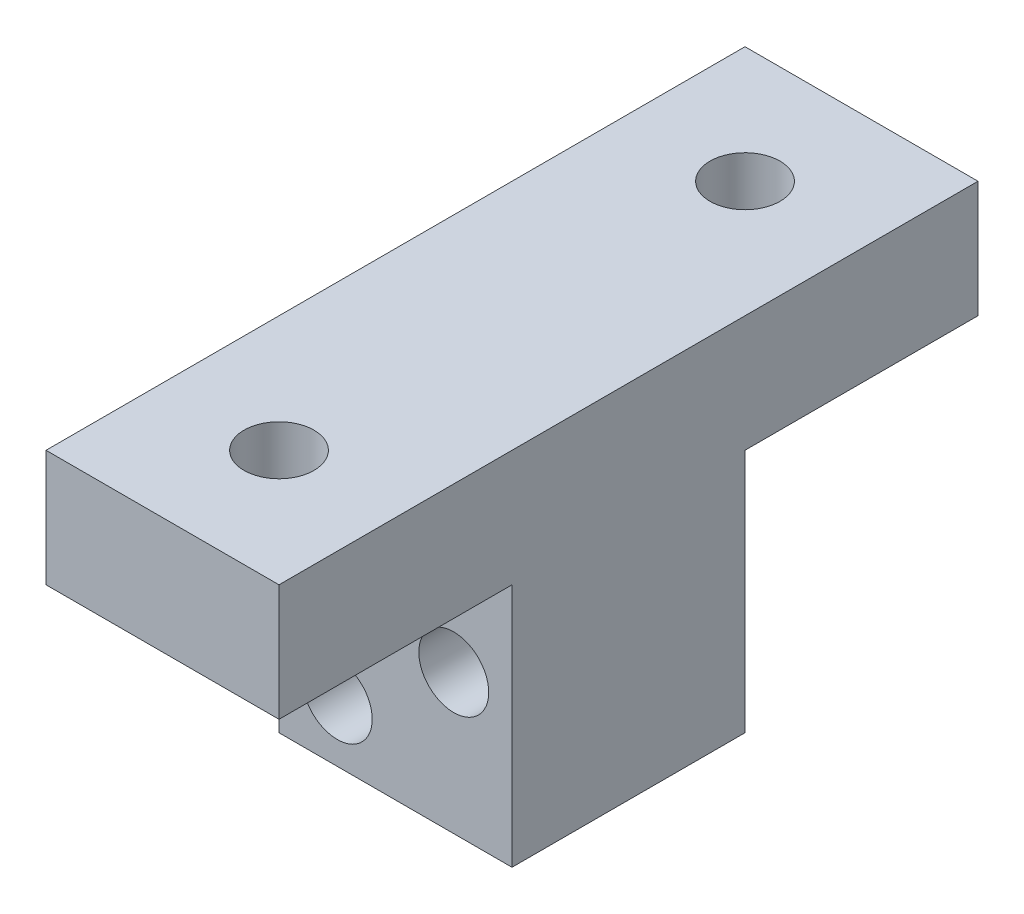
ISO-10303-21;
HEADER;
FILE_DESCRIPTION(('STEP AP214'),'2;1');
FILE_NAME('part.step','',(''),(''),'','','');
FILE_SCHEMA(('AUTOMOTIVE_DESIGN { 1 0 10303 214 1 1 1 1 }'));
ENDSEC;
DATA;
#1=APPLICATION_CONTEXT('core data for automotive mechanical design processes');
#2=APPLICATION_PROTOCOL_DEFINITION('international standard','automotive_design',2000,#1);
#3=PRODUCT_CONTEXT('',#1,'mechanical');
#4=PRODUCT('Part','Part','',(#3));
#5=PRODUCT_RELATED_PRODUCT_CATEGORY('part','',(#4));
#6=PRODUCT_DEFINITION_FORMATION('','',#4);
#7=PRODUCT_DEFINITION_CONTEXT('part definition',#1,'design');
#8=PRODUCT_DEFINITION('design','',#6,#7);
#9=PRODUCT_DEFINITION_SHAPE('','',#8);
#10=(LENGTH_UNIT() NAMED_UNIT(*) SI_UNIT(.MILLI.,.METRE.));
#11=(NAMED_UNIT(*) PLANE_ANGLE_UNIT() SI_UNIT($,.RADIAN.));
#12=(NAMED_UNIT(*) SI_UNIT($,.STERADIAN.) SOLID_ANGLE_UNIT());
#13=UNCERTAINTY_MEASURE_WITH_UNIT(LENGTH_MEASURE(1.E-05),#10,'distance_accuracy_value','');
#14=(GEOMETRIC_REPRESENTATION_CONTEXT(3) GLOBAL_UNCERTAINTY_ASSIGNED_CONTEXT((#13)) GLOBAL_UNIT_ASSIGNED_CONTEXT((#10,
#11,#12)) REPRESENTATION_CONTEXT('',''));
#15=CARTESIAN_POINT('',(0.,0.,0.));
#16=DIRECTION('',(0.,0.,1.));
#17=DIRECTION('',(1.,0.,0.));
#18=AXIS2_PLACEMENT_3D('',#15,#16,#17);
#19=CARTESIAN_POINT('',(0.,0.,10.));
#20=DIRECTION('',(0.,0.,1.));
#21=DIRECTION('',(1.,0.,0.));
#22=AXIS2_PLACEMENT_3D('',#19,#20,#21);
#23=PLANE('',#22);
#24=CARTESIAN_POINT('',(2.49999999999999,-1.75,10.));
#25=DIRECTION('',(0.,0.,1.));
#26=DIRECTION('',(1.,0.,0.));
#27=AXIS2_PLACEMENT_3D('',#24,#25,#26);
#28=CIRCLE('',#27,1.5);
#29=CARTESIAN_POINT('',(3.99999999999999,-1.75,10.));
#30=VERTEX_POINT('',#29);
#31=EDGE_CURVE('E191',#30,#30,#28,.T.);
#32=ORIENTED_EDGE('',*,*,#31,.F.);
#33=EDGE_LOOP('',(#32));
#34=FACE_BOUND('',#33,.T.);
#35=CARTESIAN_POINT('',(-2.50000000000001,-5.25,10.));
#36=DIRECTION('',(0.,0.,1.));
#37=DIRECTION('',(1.,0.,0.));
#38=AXIS2_PLACEMENT_3D('',#35,#36,#37);
#39=CIRCLE('',#38,1.5);
#40=CARTESIAN_POINT('',(-1.00000000000001,-5.25,10.));
#41=VERTEX_POINT('',#40);
#42=EDGE_CURVE('E185',#41,#41,#39,.T.);
#43=ORIENTED_EDGE('',*,*,#42,.F.);
#44=EDGE_LOOP('',(#43));
#45=FACE_BOUND('',#44,.T.);
#46=DIRECTION('',(0.,1.,0.));
#47=VECTOR('',#46,1.);
#48=CARTESIAN_POINT('',(4.99999999999999,-7.75,10.));
#49=LINE('',#48,#47);
#50=CARTESIAN_POINT('',(4.99999999999999,-7.75,10.));
#51=VERTEX_POINT('',#50);
#52=CARTESIAN_POINT('',(5.,2.75,10.));
#53=VERTEX_POINT('',#52);
#54=EDGE_CURVE('E128',#51,#53,#49,.T.);
#55=ORIENTED_EDGE('',*,*,#54,.T.);
#56=DIRECTION('',(-1.,0.,0.));
#57=VECTOR('',#56,1.);
#58=CARTESIAN_POINT('',(-5.00000000000001,2.75,10.));
#59=LINE('',#58,#57);
#60=CARTESIAN_POINT('',(-5.00000000000001,2.75,10.));
#61=VERTEX_POINT('',#60);
#62=EDGE_CURVE('E151',#53,#61,#59,.T.);
#63=ORIENTED_EDGE('',*,*,#62,.T.);
#64=DIRECTION('',(0.,-1.,0.));
#65=VECTOR('',#64,1.);
#66=CARTESIAN_POINT('',(-5.00000000000001,-7.75,10.));
#67=LINE('',#66,#65);
#68=CARTESIAN_POINT('',(-5.00000000000001,-7.75,10.));
#69=VERTEX_POINT('',#68);
#70=EDGE_CURVE('E132',#61,#69,#67,.T.);
#71=ORIENTED_EDGE('',*,*,#70,.T.);
#72=DIRECTION('',(1.,0.,0.));
#73=VECTOR('',#72,1.);
#74=CARTESIAN_POINT('',(4.99999999999999,-7.75,10.));
#75=LINE('',#74,#73);
#76=EDGE_CURVE('E145',#69,#51,#75,.T.);
#77=ORIENTED_EDGE('',*,*,#76,.T.);
#78=EDGE_LOOP('',(#55,#63,#71,#77));
#79=FACE_BOUND('',#78,.T.);
#80=ADVANCED_FACE('F34',(#34,#45,#79),#23,.T.);
#81=CARTESIAN_POINT('',(-5.00000000000001,-7.75,10.));
#82=DIRECTION('',(1.,0.,0.));
#83=DIRECTION('',(0.,0.,-1.));
#84=AXIS2_PLACEMENT_3D('',#81,#82,#83);
#85=PLANE('',#84);
#86=DIRECTION('',(0.,0.,-1.));
#87=VECTOR('',#86,1.);
#88=CARTESIAN_POINT('',(-5.00000000000001,7.75,10.));
#89=LINE('',#88,#87);
#90=CARTESIAN_POINT('',(-5.00000000000001,7.75,20.));
#91=VERTEX_POINT('',#90);
#92=CARTESIAN_POINT('',(-5.00000000000001,7.75,-10.));
#93=VERTEX_POINT('',#92);
#94=EDGE_CURVE('E133',#91,#93,#89,.T.);
#95=ORIENTED_EDGE('',*,*,#94,.T.);
#96=DIRECTION('',(0.,1.,0.));
#97=VECTOR('',#96,1.);
#98=CARTESIAN_POINT('',(-5.00000000000001,2.75,-10.));
#99=LINE('',#98,#97);
#100=CARTESIAN_POINT('',(-5.00000000000001,2.75,-10.));
#101=VERTEX_POINT('',#100);
#102=EDGE_CURVE('E115',#101,#93,#99,.T.);
#103=ORIENTED_EDGE('',*,*,#102,.F.);
#104=DIRECTION('',(0.,0.,1.));
#105=VECTOR('',#104,1.);
#106=CARTESIAN_POINT('',(-5.00000000000001,2.75,0.));
#107=LINE('',#106,#105);
#108=CARTESIAN_POINT('',(-5.00000000000001,2.75,0.));
#109=VERTEX_POINT('',#108);
#110=EDGE_CURVE('E103',#101,#109,#107,.T.);
#111=ORIENTED_EDGE('',*,*,#110,.T.);
#112=DIRECTION('',(0.,-1.,0.));
#113=VECTOR('',#112,1.);
#114=CARTESIAN_POINT('',(-5.00000000000001,-7.75,0.));
#115=LINE('',#114,#113);
#116=CARTESIAN_POINT('',(-5.00000000000001,-7.75,0.));
#117=VERTEX_POINT('',#116);
#118=EDGE_CURVE('E112',#109,#117,#115,.T.);
#119=ORIENTED_EDGE('',*,*,#118,.T.);
#120=DIRECTION('',(0.,0.,-1.));
#121=VECTOR('',#120,1.);
#122=CARTESIAN_POINT('',(-5.00000000000001,-7.75,10.));
#123=LINE('',#122,#121);
#124=EDGE_CURVE('E11',#69,#117,#123,.T.);
#125=ORIENTED_EDGE('',*,*,#124,.F.);
#126=ORIENTED_EDGE('',*,*,#70,.F.);
#127=DIRECTION('',(0.,0.,1.));
#128=VECTOR('',#127,1.);
#129=CARTESIAN_POINT('',(-5.00000000000001,2.75,10.));
#130=LINE('',#129,#128);
#131=CARTESIAN_POINT('',(-5.00000000000001,2.75,20.));
#132=VERTEX_POINT('',#131);
#133=EDGE_CURVE('E57',#61,#132,#130,.T.);
#134=ORIENTED_EDGE('',*,*,#133,.T.);
#135=DIRECTION('',(0.,1.,0.));
#136=VECTOR('',#135,1.);
#137=CARTESIAN_POINT('',(-5.00000000000001,2.75,20.));
#138=LINE('',#137,#136);
#139=EDGE_CURVE('E125',#132,#91,#138,.T.);
#140=ORIENTED_EDGE('',*,*,#139,.T.);
#141=EDGE_LOOP('',(#95,#103,#111,#119,#125,#126,#134,#140));
#142=FACE_BOUND('',#141,.T.);
#143=ADVANCED_FACE('F36',(#142),#85,.F.);
#144=CARTESIAN_POINT('',(4.99999999999999,-7.75,10.));
#145=DIRECTION('',(0.,1.,0.));
#146=DIRECTION('',(-1.,0.,0.));
#147=AXIS2_PLACEMENT_3D('',#144,#145,#146);
#148=PLANE('',#147);
#149=DIRECTION('',(1.,0.,0.));
#150=VECTOR('',#149,1.);
#151=CARTESIAN_POINT('',(4.99999999999999,-7.75,0.));
#152=LINE('',#151,#150);
#153=CARTESIAN_POINT('',(4.99999999999999,-7.75,0.));
#154=VERTEX_POINT('',#153);
#155=EDGE_CURVE('E119',#117,#154,#152,.T.);
#156=ORIENTED_EDGE('',*,*,#155,.T.);
#157=DIRECTION('',(0.,0.,-1.));
#158=VECTOR('',#157,1.);
#159=CARTESIAN_POINT('',(4.99999999999999,-7.75,10.));
#160=LINE('',#159,#158);
#161=EDGE_CURVE('E42',#51,#154,#160,.T.);
#162=ORIENTED_EDGE('',*,*,#161,.F.);
#163=ORIENTED_EDGE('',*,*,#76,.F.);
#164=ORIENTED_EDGE('',*,*,#124,.T.);
#165=EDGE_LOOP('',(#156,#162,#163,#164));
#166=FACE_BOUND('',#165,.T.);
#167=ADVANCED_FACE('F144',(#166),#148,.F.);
#168=CARTESIAN_POINT('',(4.99999999999999,-7.75,10.));
#169=DIRECTION('',(-1.,0.,0.));
#170=DIRECTION('',(0.,-1.,0.));
#171=AXIS2_PLACEMENT_3D('',#168,#169,#170);
#172=PLANE('',#171);
#173=DIRECTION('',(0.,1.,0.));
#174=VECTOR('',#173,1.);
#175=CARTESIAN_POINT('',(4.99999999999999,-7.75,0.));
#176=LINE('',#175,#174);
#177=CARTESIAN_POINT('',(4.99999999999999,2.75,0.));
#178=VERTEX_POINT('',#177);
#179=EDGE_CURVE('E122',#154,#178,#176,.T.);
#180=ORIENTED_EDGE('',*,*,#179,.T.);
#181=DIRECTION('',(0.,0.,-1.));
#182=VECTOR('',#181,1.);
#183=CARTESIAN_POINT('',(5.,2.75,0.));
#184=LINE('',#183,#182);
#185=CARTESIAN_POINT('',(5.,2.75,-10.));
#186=VERTEX_POINT('',#185);
#187=EDGE_CURVE('E49',#178,#186,#184,.T.);
#188=ORIENTED_EDGE('',*,*,#187,.T.);
#189=DIRECTION('',(0.,1.,0.));
#190=VECTOR('',#189,1.);
#191=CARTESIAN_POINT('',(5.,2.75,-10.));
#192=LINE('',#191,#190);
#193=CARTESIAN_POINT('',(5.,7.75,-10.));
#194=VERTEX_POINT('',#193);
#195=EDGE_CURVE('E163',#186,#194,#192,.T.);
#196=ORIENTED_EDGE('',*,*,#195,.T.);
#197=DIRECTION('',(0.,0.,-1.));
#198=VECTOR('',#197,1.);
#199=CARTESIAN_POINT('',(5.,7.75,10.));
#200=LINE('',#199,#198);
#201=CARTESIAN_POINT('',(5.,7.75,20.));
#202=VERTEX_POINT('',#201);
#203=EDGE_CURVE('E135',#202,#194,#200,.T.);
#204=ORIENTED_EDGE('',*,*,#203,.F.);
#205=DIRECTION('',(0.,1.,0.));
#206=VECTOR('',#205,1.);
#207=CARTESIAN_POINT('',(5.,2.75,20.));
#208=LINE('',#207,#206);
#209=CARTESIAN_POINT('',(5.,2.75,20.));
#210=VERTEX_POINT('',#209);
#211=EDGE_CURVE('E120',#210,#202,#208,.T.);
#212=ORIENTED_EDGE('',*,*,#211,.F.);
#213=DIRECTION('',(0.,0.,-1.));
#214=VECTOR('',#213,1.);
#215=CARTESIAN_POINT('',(5.,2.75,10.));
#216=LINE('',#215,#214);
#217=EDGE_CURVE('E157',#210,#53,#216,.T.);
#218=ORIENTED_EDGE('',*,*,#217,.T.);
#219=ORIENTED_EDGE('',*,*,#54,.F.);
#220=ORIENTED_EDGE('',*,*,#161,.T.);
#221=EDGE_LOOP('',(#180,#188,#196,#204,#212,#218,#219,#220));
#222=FACE_BOUND('',#221,.T.);
#223=ADVANCED_FACE('F140',(#222),#172,.F.);
#224=CARTESIAN_POINT('',(5.,7.75,10.));
#225=DIRECTION('',(0.,-1.,0.));
#226=DIRECTION('',(0.,0.,-1.));
#227=AXIS2_PLACEMENT_3D('',#224,#225,#226);
#228=PLANE('',#227);
#229=CARTESIAN_POINT('',(0.,7.75,15.));
#230=DIRECTION('',(0.,-1.,0.));
#231=DIRECTION('',(0.,0.,-1.));
#232=AXIS2_PLACEMENT_3D('',#229,#230,#231);
#233=CIRCLE('',#232,1.5);
#234=CARTESIAN_POINT('',(0.,7.75,13.5));
#235=VERTEX_POINT('',#234);
#236=EDGE_CURVE('E176',#235,#235,#233,.T.);
#237=ORIENTED_EDGE('',*,*,#236,.T.);
#238=EDGE_LOOP('',(#237));
#239=FACE_BOUND('',#238,.T.);
#240=CARTESIAN_POINT('',(0.,7.75,-5.));
#241=DIRECTION('',(0.,-1.,0.));
#242=DIRECTION('',(0.,0.,-1.));
#243=AXIS2_PLACEMENT_3D('',#240,#241,#242);
#244=CIRCLE('',#243,1.5);
#245=CARTESIAN_POINT('',(0.,7.75,-6.5));
#246=VERTEX_POINT('',#245);
#247=EDGE_CURVE('E170',#246,#246,#244,.T.);
#248=ORIENTED_EDGE('',*,*,#247,.T.);
#249=EDGE_LOOP('',(#248));
#250=FACE_BOUND('',#249,.T.);
#251=ORIENTED_EDGE('',*,*,#203,.T.);
#252=DIRECTION('',(-1.,0.,0.));
#253=VECTOR('',#252,1.);
#254=CARTESIAN_POINT('',(-5.00000000000001,7.75,-10.));
#255=LINE('',#254,#253);
#256=EDGE_CURVE('E116',#194,#93,#255,.T.);
#257=ORIENTED_EDGE('',*,*,#256,.T.);
#258=ORIENTED_EDGE('',*,*,#94,.F.);
#259=DIRECTION('',(1.,0.,0.));
#260=VECTOR('',#259,1.);
#261=CARTESIAN_POINT('',(-5.00000000000001,7.75,20.));
#262=LINE('',#261,#260);
#263=EDGE_CURVE('E153',#91,#202,#262,.T.);
#264=ORIENTED_EDGE('',*,*,#263,.T.);
#265=EDGE_LOOP('',(#251,#257,#258,#264));
#266=FACE_BOUND('',#265,.T.);
#267=ADVANCED_FACE('F219',(#239,#250,#266),#228,.F.);
#268=CARTESIAN_POINT('',(0.,0.,0.));
#269=DIRECTION('',(0.,0.,1.));
#270=DIRECTION('',(1.,0.,0.));
#271=AXIS2_PLACEMENT_3D('',#268,#269,#270);
#272=PLANE('',#271);
#273=CARTESIAN_POINT('',(2.49999999999999,-1.75,0.));
#274=DIRECTION('',(0.,0.,1.));
#275=DIRECTION('',(1.,0.,0.));
#276=AXIS2_PLACEMENT_3D('',#273,#274,#275);
#277=CIRCLE('',#276,1.5);
#278=CARTESIAN_POINT('',(3.99999999999999,-1.75,0.));
#279=VERTEX_POINT('',#278);
#280=EDGE_CURVE('E188',#279,#279,#277,.T.);
#281=ORIENTED_EDGE('',*,*,#280,.T.);
#282=EDGE_LOOP('',(#281));
#283=FACE_BOUND('',#282,.T.);
#284=CARTESIAN_POINT('',(-2.50000000000001,-5.25,0.));
#285=DIRECTION('',(0.,0.,1.));
#286=DIRECTION('',(1.,0.,0.));
#287=AXIS2_PLACEMENT_3D('',#284,#285,#286);
#288=CIRCLE('',#287,1.5);
#289=CARTESIAN_POINT('',(-1.00000000000001,-5.25,0.));
#290=VERTEX_POINT('',#289);
#291=EDGE_CURVE('E182',#290,#290,#288,.T.);
#292=ORIENTED_EDGE('',*,*,#291,.T.);
#293=EDGE_LOOP('',(#292));
#294=FACE_BOUND('',#293,.T.);
#295=ORIENTED_EDGE('',*,*,#118,.F.);
#296=DIRECTION('',(1.,0.,0.));
#297=VECTOR('',#296,1.);
#298=CARTESIAN_POINT('',(-5.00000000000001,2.75,0.));
#299=LINE('',#298,#297);
#300=EDGE_CURVE('E100',#109,#178,#299,.T.);
#301=ORIENTED_EDGE('',*,*,#300,.T.);
#302=ORIENTED_EDGE('',*,*,#179,.F.);
#303=ORIENTED_EDGE('',*,*,#155,.F.);
#304=EDGE_LOOP('',(#295,#301,#302,#303));
#305=FACE_BOUND('',#304,.T.);
#306=ADVANCED_FACE('F118',(#283,#294,#305),#272,.F.);
#307=CARTESIAN_POINT('',(-5.00000000000001,2.75,20.));
#308=DIRECTION('',(0.,0.,1.));
#309=DIRECTION('',(1.,0.,0.));
#310=AXIS2_PLACEMENT_3D('',#307,#308,#309);
#311=PLANE('',#310);
#312=ORIENTED_EDGE('',*,*,#263,.F.);
#313=ORIENTED_EDGE('',*,*,#139,.F.);
#314=DIRECTION('',(1.,0.,0.));
#315=VECTOR('',#314,1.);
#316=CARTESIAN_POINT('',(-5.00000000000001,2.75,20.));
#317=LINE('',#316,#315);
#318=EDGE_CURVE('E159',#132,#210,#317,.T.);
#319=ORIENTED_EDGE('',*,*,#318,.T.);
#320=ORIENTED_EDGE('',*,*,#211,.T.);
#321=EDGE_LOOP('',(#312,#313,#319,#320));
#322=FACE_BOUND('',#321,.T.);
#323=ADVANCED_FACE('F214',(#322),#311,.T.);
#324=CARTESIAN_POINT('',(0.,2.75,0.));
#325=DIRECTION('',(0.,1.,0.));
#326=DIRECTION('',(0.,0.,1.));
#327=AXIS2_PLACEMENT_3D('',#324,#325,#326);
#328=PLANE('',#327);
#329=CARTESIAN_POINT('',(0.,2.75,15.));
#330=DIRECTION('',(0.,-1.,0.));
#331=DIRECTION('',(0.,0.,-1.));
#332=AXIS2_PLACEMENT_3D('',#329,#330,#331);
#333=CIRCLE('',#332,1.5);
#334=CARTESIAN_POINT('',(0.,2.75,13.5));
#335=VERTEX_POINT('',#334);
#336=EDGE_CURVE('E179',#335,#335,#333,.T.);
#337=ORIENTED_EDGE('',*,*,#336,.F.);
#338=EDGE_LOOP('',(#337));
#339=FACE_BOUND('',#338,.T.);
#340=ORIENTED_EDGE('',*,*,#133,.F.);
#341=ORIENTED_EDGE('',*,*,#62,.F.);
#342=ORIENTED_EDGE('',*,*,#217,.F.);
#343=ORIENTED_EDGE('',*,*,#318,.F.);
#344=EDGE_LOOP('',(#340,#341,#342,#343));
#345=FACE_BOUND('',#344,.T.);
#346=ADVANCED_FACE('F211',(#339,#345),#328,.F.);
#347=CARTESIAN_POINT('',(-5.00000000000001,2.75,-10.));
#348=DIRECTION('',(0.,0.,-1.));
#349=DIRECTION('',(-1.,0.,0.));
#350=AXIS2_PLACEMENT_3D('',#347,#348,#349);
#351=PLANE('',#350);
#352=ORIENTED_EDGE('',*,*,#256,.F.);
#353=ORIENTED_EDGE('',*,*,#195,.F.);
#354=DIRECTION('',(-1.,0.,0.));
#355=VECTOR('',#354,1.);
#356=CARTESIAN_POINT('',(-5.00000000000001,2.75,-10.));
#357=LINE('',#356,#355);
#358=EDGE_CURVE('E166',#186,#101,#357,.T.);
#359=ORIENTED_EDGE('',*,*,#358,.T.);
#360=ORIENTED_EDGE('',*,*,#102,.T.);
#361=EDGE_LOOP('',(#352,#353,#359,#360));
#362=FACE_BOUND('',#361,.T.);
#363=ADVANCED_FACE('F218',(#362),#351,.T.);
#364=CARTESIAN_POINT('',(0.,2.75,0.));
#365=DIRECTION('',(0.,-1.,0.));
#366=DIRECTION('',(0.,0.,-1.));
#367=AXIS2_PLACEMENT_3D('',#364,#365,#366);
#368=PLANE('',#367);
#369=CARTESIAN_POINT('',(0.,2.75,-5.));
#370=DIRECTION('',(0.,-1.,0.));
#371=DIRECTION('',(0.,0.,-1.));
#372=AXIS2_PLACEMENT_3D('',#369,#370,#371);
#373=CIRCLE('',#372,1.5);
#374=CARTESIAN_POINT('',(0.,2.75,-6.5));
#375=VERTEX_POINT('',#374);
#376=EDGE_CURVE('E173',#375,#375,#373,.T.);
#377=ORIENTED_EDGE('',*,*,#376,.F.);
#378=EDGE_LOOP('',(#377));
#379=FACE_BOUND('',#378,.T.);
#380=ORIENTED_EDGE('',*,*,#110,.F.);
#381=ORIENTED_EDGE('',*,*,#358,.F.);
#382=ORIENTED_EDGE('',*,*,#187,.F.);
#383=ORIENTED_EDGE('',*,*,#300,.F.);
#384=EDGE_LOOP('',(#380,#381,#382,#383));
#385=FACE_BOUND('',#384,.T.);
#386=ADVANCED_FACE('F102',(#379,#385),#368,.T.);
#387=CARTESIAN_POINT('',(0.,7.75,-5.));
#388=DIRECTION('',(0.,-1.,0.));
#389=DIRECTION('',(0.,0.,-1.));
#390=AXIS2_PLACEMENT_3D('',#387,#388,#389);
#391=CYLINDRICAL_SURFACE('',#390,1.5);
#392=ORIENTED_EDGE('',*,*,#247,.F.);
#393=EDGE_LOOP('',(#392));
#394=FACE_BOUND('',#393,.T.);
#395=ORIENTED_EDGE('',*,*,#376,.T.);
#396=EDGE_LOOP('',(#395));
#397=FACE_BOUND('',#396,.T.);
#398=ADVANCED_FACE('F274',(#394,#397),#391,.F.);
#399=CARTESIAN_POINT('',(0.,7.75,15.));
#400=DIRECTION('',(0.,-1.,0.));
#401=DIRECTION('',(0.,0.,-1.));
#402=AXIS2_PLACEMENT_3D('',#399,#400,#401);
#403=CYLINDRICAL_SURFACE('',#402,1.5);
#404=ORIENTED_EDGE('',*,*,#236,.F.);
#405=EDGE_LOOP('',(#404));
#406=FACE_BOUND('',#405,.T.);
#407=ORIENTED_EDGE('',*,*,#336,.T.);
#408=EDGE_LOOP('',(#407));
#409=FACE_BOUND('',#408,.T.);
#410=ADVANCED_FACE('F249',(#406,#409),#403,.F.);
#411=CARTESIAN_POINT('',(-2.50000000000001,-5.25,0.));
#412=DIRECTION('',(0.,0.,1.));
#413=DIRECTION('',(1.,0.,0.));
#414=AXIS2_PLACEMENT_3D('',#411,#412,#413);
#415=CYLINDRICAL_SURFACE('',#414,1.5);
#416=ORIENTED_EDGE('',*,*,#291,.F.);
#417=EDGE_LOOP('',(#416));
#418=FACE_BOUND('',#417,.T.);
#419=ORIENTED_EDGE('',*,*,#42,.T.);
#420=EDGE_LOOP('',(#419));
#421=FACE_BOUND('',#420,.T.);
#422=ADVANCED_FACE('F202',(#418,#421),#415,.F.);
#423=CARTESIAN_POINT('',(2.49999999999999,-1.75,0.));
#424=DIRECTION('',(0.,0.,1.));
#425=DIRECTION('',(1.,0.,0.));
#426=AXIS2_PLACEMENT_3D('',#423,#424,#425);
#427=CYLINDRICAL_SURFACE('',#426,1.5);
#428=ORIENTED_EDGE('',*,*,#280,.F.);
#429=EDGE_LOOP('',(#428));
#430=FACE_BOUND('',#429,.T.);
#431=ORIENTED_EDGE('',*,*,#31,.T.);
#432=EDGE_LOOP('',(#431));
#433=FACE_BOUND('',#432,.T.);
#434=ADVANCED_FACE('F199',(#430,#433),#427,.F.);
#435=CLOSED_SHELL('',(#80,#143,#167,#223,#267,#306,#323,#346,#363,#386,#398,#410,#422,#434));
#436=MANIFOLD_SOLID_BREP('B2',#435);
#437=ADVANCED_BREP_SHAPE_REPRESENTATION('',(#18,#436),#14);
#438=SHAPE_DEFINITION_REPRESENTATION(#9,#437);
ENDSEC;
END-ISO-10303-21;
